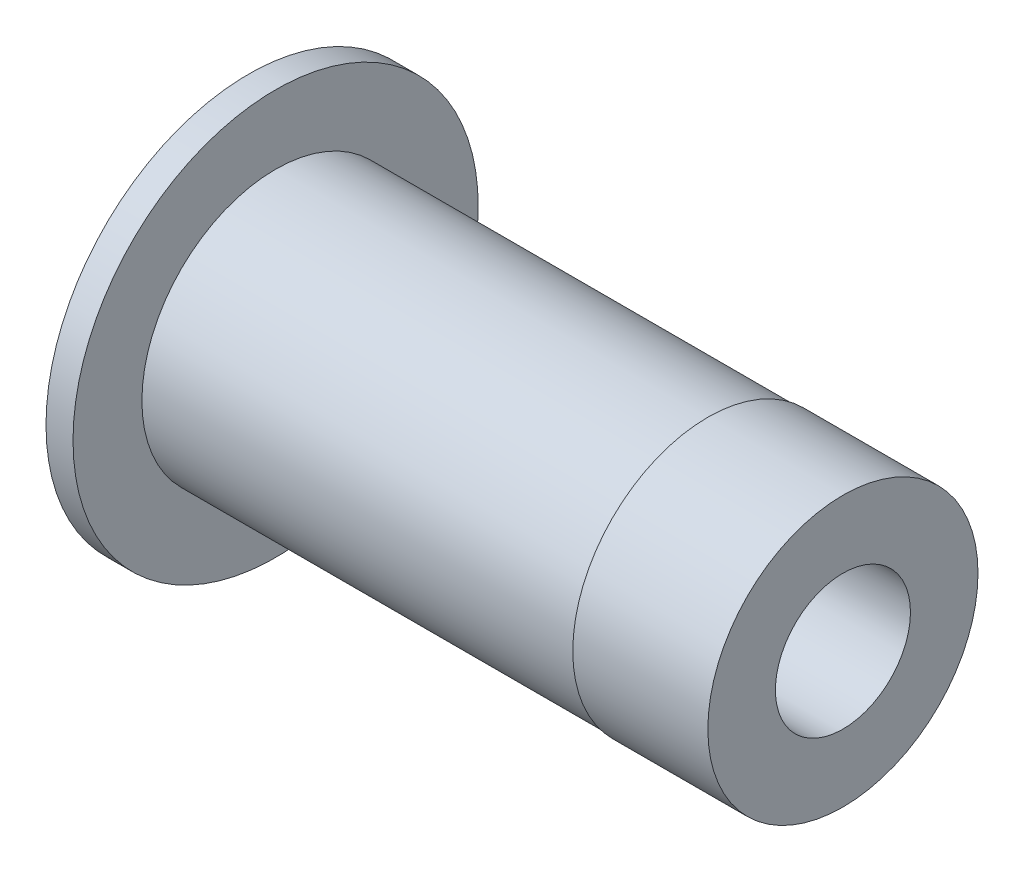
ISO-10303-21;
HEADER;
FILE_DESCRIPTION(('STEP AP214'),'2;1');
FILE_NAME('part.step','',(''),(''),'','','');
FILE_SCHEMA(('AUTOMOTIVE_DESIGN { 1 0 10303 214 1 1 1 1 }'));
ENDSEC;
DATA;
#1=APPLICATION_CONTEXT('core data for automotive mechanical design processes');
#2=APPLICATION_PROTOCOL_DEFINITION('international standard','automotive_design',2000,#1);
#3=PRODUCT_CONTEXT('',#1,'mechanical');
#4=PRODUCT('Part','Part','',(#3));
#5=PRODUCT_RELATED_PRODUCT_CATEGORY('part','',(#4));
#6=PRODUCT_DEFINITION_FORMATION('','',#4);
#7=PRODUCT_DEFINITION_CONTEXT('part definition',#1,'design');
#8=PRODUCT_DEFINITION('design','',#6,#7);
#9=PRODUCT_DEFINITION_SHAPE('','',#8);
#10=(LENGTH_UNIT() NAMED_UNIT(*) SI_UNIT(.MILLI.,.METRE.));
#11=(NAMED_UNIT(*) PLANE_ANGLE_UNIT() SI_UNIT($,.RADIAN.));
#12=(NAMED_UNIT(*) SI_UNIT($,.STERADIAN.) SOLID_ANGLE_UNIT());
#13=UNCERTAINTY_MEASURE_WITH_UNIT(LENGTH_MEASURE(1.E-05),#10,'distance_accuracy_value','');
#14=(GEOMETRIC_REPRESENTATION_CONTEXT(3) GLOBAL_UNCERTAINTY_ASSIGNED_CONTEXT((#13)) GLOBAL_UNIT_ASSIGNED_CONTEXT((#10,
#11,#12)) REPRESENTATION_CONTEXT('',''));
#15=CARTESIAN_POINT('',(0.,0.,0.));
#16=DIRECTION('',(0.,0.,1.));
#17=DIRECTION('',(1.,0.,0.));
#18=AXIS2_PLACEMENT_3D('',#15,#16,#17);
#19=CARTESIAN_POINT('',(42.,0.,0.));
#20=DIRECTION('',(1.,0.,0.));
#21=DIRECTION('',(0.,0.,-1.));
#22=AXIS2_PLACEMENT_3D('',#19,#20,#21);
#23=PLANE('',#22);
#24=CARTESIAN_POINT('',(42.,0.,0.));
#25=DIRECTION('',(1.,0.,0.));
#26=DIRECTION('',(0.,0.,-1.));
#27=AXIS2_PLACEMENT_3D('',#24,#25,#26);
#28=CIRCLE('',#27,10.);
#29=CARTESIAN_POINT('',(42.,0.,-10.));
#30=VERTEX_POINT('',#29);
#31=EDGE_CURVE('E11',#30,#30,#28,.T.);
#32=ORIENTED_EDGE('',*,*,#31,.T.);
#33=EDGE_LOOP('',(#32));
#34=FACE_BOUND('',#33,.T.);
#35=CARTESIAN_POINT('',(42.,0.,0.));
#36=DIRECTION('',(1.,0.,0.));
#37=DIRECTION('',(0.,0.,-1.));
#38=AXIS2_PLACEMENT_3D('',#35,#36,#37);
#39=CIRCLE('',#38,5.);
#40=CARTESIAN_POINT('',(42.,0.,-5.));
#41=VERTEX_POINT('',#40);
#42=EDGE_CURVE('E56',#41,#41,#39,.T.);
#43=ORIENTED_EDGE('',*,*,#42,.F.);
#44=EDGE_LOOP('',(#43));
#45=FACE_BOUND('',#44,.T.);
#46=ADVANCED_FACE('F45',(#34,#45),#23,.T.);
#47=CARTESIAN_POINT('',(32.,0.,0.));
#48=DIRECTION('',(1.,0.,0.));
#49=DIRECTION('',(0.,0.,-1.));
#50=AXIS2_PLACEMENT_3D('',#47,#48,#49);
#51=PLANE('',#50);
#52=CARTESIAN_POINT('',(32.,0.,0.));
#53=DIRECTION('',(1.,0.,0.));
#54=DIRECTION('',(0.,0.,-1.));
#55=AXIS2_PLACEMENT_3D('',#52,#53,#54);
#56=CIRCLE('',#55,10.);
#57=CARTESIAN_POINT('',(32.,0.,-10.));
#58=VERTEX_POINT('',#57);
#59=EDGE_CURVE('E49',#58,#58,#56,.T.);
#60=ORIENTED_EDGE('',*,*,#59,.F.);
#61=EDGE_LOOP('',(#60));
#62=FACE_BOUND('',#61,.T.);
#63=CARTESIAN_POINT('',(32.,0.,0.));
#64=DIRECTION('',(1.,0.,0.));
#65=DIRECTION('',(0.,0.,-1.));
#66=AXIS2_PLACEMENT_3D('',#63,#64,#65);
#67=CIRCLE('',#66,5.);
#68=CARTESIAN_POINT('',(32.,0.,-5.));
#69=VERTEX_POINT('',#68);
#70=EDGE_CURVE('E58',#69,#69,#67,.T.);
#71=ORIENTED_EDGE('',*,*,#70,.T.);
#72=EDGE_LOOP('',(#71));
#73=FACE_BOUND('',#72,.T.);
#74=ADVANCED_FACE('F68',(#62,#73),#51,.F.);
#75=CARTESIAN_POINT('',(42.,0.,0.));
#76=DIRECTION('',(-1.,0.,0.));
#77=DIRECTION('',(0.,0.,1.));
#78=AXIS2_PLACEMENT_3D('',#75,#76,#77);
#79=CYLINDRICAL_SURFACE('',#78,10.);
#80=ORIENTED_EDGE('',*,*,#31,.F.);
#81=EDGE_LOOP('',(#80));
#82=FACE_BOUND('',#81,.T.);
#83=ORIENTED_EDGE('',*,*,#59,.T.);
#84=EDGE_LOOP('',(#83));
#85=FACE_BOUND('',#84,.T.);
#86=ADVANCED_FACE('F47',(#82,#85),#79,.T.);
#87=CARTESIAN_POINT('',(42.,0.,0.));
#88=DIRECTION('',(-1.,0.,0.));
#89=DIRECTION('',(0.,0.,1.));
#90=AXIS2_PLACEMENT_3D('',#87,#88,#89);
#91=CYLINDRICAL_SURFACE('',#90,5.);
#92=ORIENTED_EDGE('',*,*,#42,.T.);
#93=EDGE_LOOP('',(#92));
#94=FACE_BOUND('',#93,.T.);
#95=ORIENTED_EDGE('',*,*,#70,.F.);
#96=EDGE_LOOP('',(#95));
#97=FACE_BOUND('',#96,.T.);
#98=ADVANCED_FACE('F64',(#94,#97),#91,.F.);
#99=CLOSED_SHELL('',(#46,#74,#86,#98));
#100=MANIFOLD_SOLID_BREP('B2',#99);
#101=CARTESIAN_POINT('',(32.,0.,0.));
#102=DIRECTION('',(-1.,0.,0.));
#103=DIRECTION('',(0.,0.,1.));
#104=AXIS2_PLACEMENT_3D('',#101,#102,#103);
#105=CYLINDRICAL_SURFACE('',#104,9.9);
#106=CARTESIAN_POINT('',(32.,0.,0.));
#107=DIRECTION('',(1.,0.,0.));
#108=DIRECTION('',(0.,0.,-1.));
#109=AXIS2_PLACEMENT_3D('',#106,#107,#108);
#110=CIRCLE('',#109,9.9);
#111=CARTESIAN_POINT('',(32.,0.,-9.9));
#112=VERTEX_POINT('',#111);
#113=EDGE_CURVE('E44',#112,#112,#110,.T.);
#114=ORIENTED_EDGE('',*,*,#113,.F.);
#115=EDGE_LOOP('',(#114));
#116=FACE_BOUND('',#115,.T.);
#117=CARTESIAN_POINT('',(0.,0.,0.));
#118=DIRECTION('',(1.,0.,0.));
#119=DIRECTION('',(0.,0.,-1.));
#120=AXIS2_PLACEMENT_3D('',#117,#118,#119);
#121=CIRCLE('',#120,9.9);
#122=CARTESIAN_POINT('',(0.,0.,-9.9));
#123=VERTEX_POINT('',#122);
#124=EDGE_CURVE('E110',#123,#123,#121,.T.);
#125=ORIENTED_EDGE('',*,*,#124,.T.);
#126=EDGE_LOOP('',(#125));
#127=FACE_BOUND('',#126,.T.);
#128=ADVANCED_FACE('F107',(#116,#127),#105,.T.);
#129=CARTESIAN_POINT('',(32.,0.,0.));
#130=DIRECTION('',(1.,0.,0.));
#131=DIRECTION('',(0.,0.,-1.));
#132=AXIS2_PLACEMENT_3D('',#129,#130,#131);
#133=PLANE('',#132);
#134=ORIENTED_EDGE('',*,*,#113,.T.);
#135=EDGE_LOOP('',(#134));
#136=FACE_BOUND('',#135,.T.);
#137=ADVANCED_FACE('F134',(#136),#133,.T.);
#138=CARTESIAN_POINT('',(-2.,0.,0.));
#139=DIRECTION('',(1.,0.,0.));
#140=DIRECTION('',(0.,0.,-1.));
#141=AXIS2_PLACEMENT_3D('',#138,#139,#140);
#142=CYLINDRICAL_SURFACE('',#141,15.);
#143=CARTESIAN_POINT('',(-2.,0.,0.));
#144=DIRECTION('',(-1.,0.,0.));
#145=DIRECTION('',(0.,0.,1.));
#146=AXIS2_PLACEMENT_3D('',#143,#144,#145);
#147=CIRCLE('',#146,15.);
#148=CARTESIAN_POINT('',(-2.,0.,15.));
#149=VERTEX_POINT('',#148);
#150=EDGE_CURVE('E119',#149,#149,#147,.T.);
#151=ORIENTED_EDGE('',*,*,#150,.F.);
#152=EDGE_LOOP('',(#151));
#153=FACE_BOUND('',#152,.T.);
#154=CARTESIAN_POINT('',(0.,0.,0.));
#155=DIRECTION('',(-1.,0.,0.));
#156=DIRECTION('',(0.,0.,1.));
#157=AXIS2_PLACEMENT_3D('',#154,#155,#156);
#158=CIRCLE('',#157,15.);
#159=CARTESIAN_POINT('',(0.,0.,15.));
#160=VERTEX_POINT('',#159);
#161=EDGE_CURVE('E121',#160,#160,#158,.T.);
#162=ORIENTED_EDGE('',*,*,#161,.T.);
#163=EDGE_LOOP('',(#162));
#164=FACE_BOUND('',#163,.T.);
#165=ADVANCED_FACE('F131',(#153,#164),#142,.T.);
#166=CARTESIAN_POINT('',(-2.,0.,0.));
#167=DIRECTION('',(-1.,0.,0.));
#168=DIRECTION('',(0.,0.,1.));
#169=AXIS2_PLACEMENT_3D('',#166,#167,#168);
#170=PLANE('',#169);
#171=ORIENTED_EDGE('',*,*,#150,.T.);
#172=EDGE_LOOP('',(#171));
#173=FACE_BOUND('',#172,.T.);
#174=ADVANCED_FACE('F129',(#173),#170,.T.);
#175=CARTESIAN_POINT('',(0.,0.,0.));
#176=DIRECTION('',(-1.,0.,0.));
#177=DIRECTION('',(0.,0.,1.));
#178=AXIS2_PLACEMENT_3D('',#175,#176,#177);
#179=PLANE('',#178);
#180=ORIENTED_EDGE('',*,*,#124,.F.);
#181=EDGE_LOOP('',(#180));
#182=FACE_BOUND('',#181,.T.);
#183=ORIENTED_EDGE('',*,*,#161,.F.);
#184=EDGE_LOOP('',(#183));
#185=FACE_BOUND('',#184,.T.);
#186=ADVANCED_FACE('F138',(#182,#185),#179,.F.);
#187=CLOSED_SHELL('',(#128,#137,#165,#174,#186));
#188=MANIFOLD_SOLID_BREP('B6',#187);
#189=ADVANCED_BREP_SHAPE_REPRESENTATION('',(#18,#100,#188),#14);
#190=SHAPE_DEFINITION_REPRESENTATION(#9,#189);
ENDSEC;
END-ISO-10303-21;
